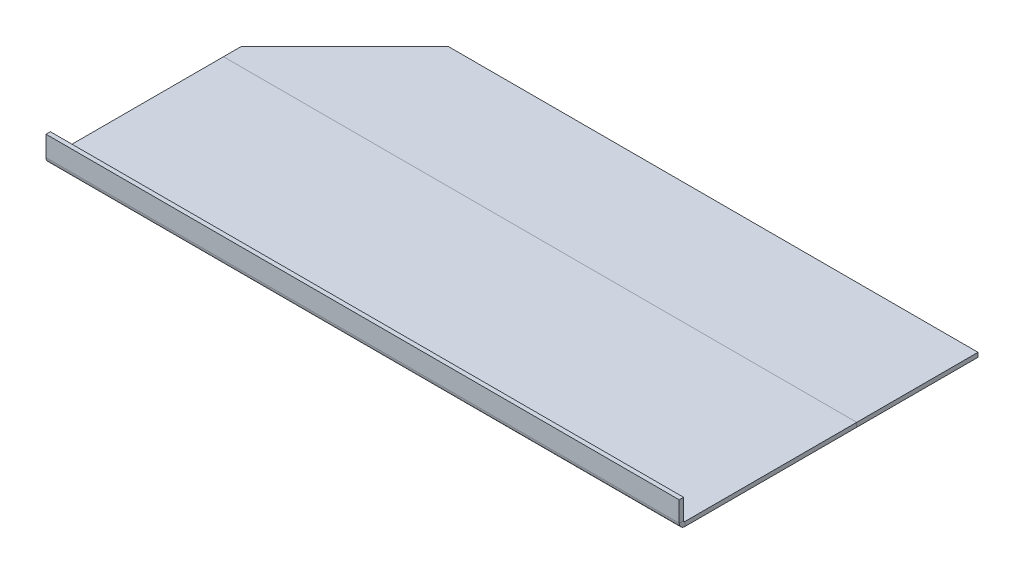
ISO-10303-21;
HEADER;
FILE_DESCRIPTION(('STEP AP214'),'2;1');
FILE_NAME('part.step','',(''),(''),'','','');
FILE_SCHEMA(('AUTOMOTIVE_DESIGN { 1 0 10303 214 1 1 1 1 }'));
ENDSEC;
DATA;
#1=APPLICATION_CONTEXT('core data for automotive mechanical design processes');
#2=APPLICATION_PROTOCOL_DEFINITION('international standard','automotive_design',2000,#1);
#3=PRODUCT_CONTEXT('',#1,'mechanical');
#4=PRODUCT('Part','Part','',(#3));
#5=PRODUCT_RELATED_PRODUCT_CATEGORY('part','',(#4));
#6=PRODUCT_DEFINITION_FORMATION('','',#4);
#7=PRODUCT_DEFINITION_CONTEXT('part definition',#1,'design');
#8=PRODUCT_DEFINITION('design','',#6,#7);
#9=PRODUCT_DEFINITION_SHAPE('','',#8);
#10=(LENGTH_UNIT() NAMED_UNIT(*) SI_UNIT(.MILLI.,.METRE.));
#11=(NAMED_UNIT(*) PLANE_ANGLE_UNIT() SI_UNIT($,.RADIAN.));
#12=(NAMED_UNIT(*) SI_UNIT($,.STERADIAN.) SOLID_ANGLE_UNIT());
#13=UNCERTAINTY_MEASURE_WITH_UNIT(LENGTH_MEASURE(1.E-05),#10,'distance_accuracy_value','');
#14=(GEOMETRIC_REPRESENTATION_CONTEXT(3) GLOBAL_UNCERTAINTY_ASSIGNED_CONTEXT((#13)) GLOBAL_UNIT_ASSIGNED_CONTEXT((#10,
#11,#12)) REPRESENTATION_CONTEXT('',''));
#15=CARTESIAN_POINT('',(0.,0.,0.));
#16=DIRECTION('',(0.,0.,1.));
#17=DIRECTION('',(1.,0.,0.));
#18=AXIS2_PLACEMENT_3D('',#15,#16,#17);
#19=CARTESIAN_POINT('',(232.0925,-3.175,-63.78575));
#20=DIRECTION('',(1.,0.,0.));
#21=DIRECTION('',(0.,0.,-1.));
#22=AXIS2_PLACEMENT_3D('',#19,#20,#21);
#23=PLANE('',#22);
#24=DIRECTION('',(0.,0.,-1.));
#25=VECTOR('',#24,1.);
#26=CARTESIAN_POINT('',(232.0925,0.,-63.78575));
#27=LINE('',#26,#25);
#28=CARTESIAN_POINT('',(232.0925,0.,62.15075));
#29=VERTEX_POINT('',#28);
#30=CARTESIAN_POINT('',(232.0925,0.,-63.78575));
#31=VERTEX_POINT('',#30);
#32=EDGE_CURVE('E118',#29,#31,#27,.T.);
#33=ORIENTED_EDGE('',*,*,#32,.F.);
#34=DIRECTION('',(0.,-1.,0.));
#35=VECTOR('',#34,1.);
#36=CARTESIAN_POINT('',(232.0925,0.,62.15075));
#37=LINE('',#36,#35);
#38=CARTESIAN_POINT('',(232.0925,-3.175,62.15075));
#39=VERTEX_POINT('',#38);
#40=EDGE_CURVE('E127',#29,#39,#37,.T.);
#41=ORIENTED_EDGE('',*,*,#40,.T.);
#42=DIRECTION('',(0.,0.,-1.));
#43=VECTOR('',#42,1.);
#44=CARTESIAN_POINT('',(232.0925,-3.175,-63.78575));
#45=LINE('',#44,#43);
#46=CARTESIAN_POINT('',(232.0925,-3.175,-63.78575));
#47=VERTEX_POINT('',#46);
#48=EDGE_CURVE('E115',#39,#47,#45,.T.);
#49=ORIENTED_EDGE('',*,*,#48,.T.);
#50=DIRECTION('',(0.,1.,0.));
#51=VECTOR('',#50,1.);
#52=CARTESIAN_POINT('',(232.0925,-3.175,-63.78575));
#53=LINE('',#52,#51);
#54=EDGE_CURVE('E73',#47,#31,#53,.T.);
#55=ORIENTED_EDGE('',*,*,#54,.T.);
#56=EDGE_LOOP('',(#33,#41,#49,#55));
#57=FACE_BOUND('',#56,.T.);
#58=ADVANCED_FACE('F70',(#57),#23,.T.);
#59=CARTESIAN_POINT('',(0.,-3.175,0.));
#60=DIRECTION('',(0.,1.,0.));
#61=DIRECTION('',(0.,0.,1.));
#62=AXIS2_PLACEMENT_3D('',#59,#60,#61);
#63=PLANE('',#62);
#64=DIRECTION('',(1.,0.,0.));
#65=VECTOR('',#64,1.);
#66=CARTESIAN_POINT('',(232.0925,-3.175,62.15075));
#67=LINE('',#66,#65);
#68=CARTESIAN_POINT('',(-232.0925,-3.175,62.15075));
#69=VERTEX_POINT('',#68);
#70=EDGE_CURVE('E143',#39,#69,#67,.F.);
#71=ORIENTED_EDGE('',*,*,#70,.T.);
#72=DIRECTION('',(0.,0.,1.));
#73=VECTOR('',#72,1.);
#74=CARTESIAN_POINT('',(-232.0925,-3.175,-63.78575));
#75=LINE('',#74,#73);
#76=CARTESIAN_POINT('',(-232.0925,-3.175,-63.78575));
#77=VERTEX_POINT('',#76);
#78=EDGE_CURVE('E123',#77,#69,#75,.T.);
#79=ORIENTED_EDGE('',*,*,#78,.F.);
#80=DIRECTION('',(-1.,0.,0.));
#81=VECTOR('',#80,1.);
#82=CARTESIAN_POINT('',(-232.0925,-3.175,-63.78575));
#83=LINE('',#82,#81);
#84=EDGE_CURVE('E108',#47,#77,#83,.T.);
#85=ORIENTED_EDGE('',*,*,#84,.F.);
#86=ORIENTED_EDGE('',*,*,#48,.F.);
#87=EDGE_LOOP('',(#71,#79,#85,#86));
#88=FACE_BOUND('',#87,.T.);
#89=ADVANCED_FACE('F221',(#88),#63,.F.);
#90=CARTESIAN_POINT('',(0.,0.,0.));
#91=DIRECTION('',(0.,1.,0.));
#92=DIRECTION('',(0.,0.,1.));
#93=AXIS2_PLACEMENT_3D('',#90,#91,#92);
#94=PLANE('',#93);
#95=DIRECTION('',(0.,0.,1.));
#96=VECTOR('',#95,1.);
#97=CARTESIAN_POINT('',(-232.0925,0.,-63.78575));
#98=LINE('',#97,#96);
#99=CARTESIAN_POINT('',(-232.0925,0.,-63.78575));
#100=VERTEX_POINT('',#99);
#101=CARTESIAN_POINT('',(-232.0925,0.,62.15075));
#102=VERTEX_POINT('',#101);
#103=EDGE_CURVE('E110',#100,#102,#98,.T.);
#104=ORIENTED_EDGE('',*,*,#103,.T.);
#105=DIRECTION('',(1.,0.,0.));
#106=VECTOR('',#105,1.);
#107=CARTESIAN_POINT('',(232.0925,0.,62.15075));
#108=LINE('',#107,#106);
#109=EDGE_CURVE('E84',#29,#102,#108,.F.);
#110=ORIENTED_EDGE('',*,*,#109,.F.);
#111=ORIENTED_EDGE('',*,*,#32,.T.);
#112=DIRECTION('',(-1.,0.,0.));
#113=VECTOR('',#112,1.);
#114=CARTESIAN_POINT('',(-232.0925,0.,-63.78575));
#115=LINE('',#114,#113);
#116=EDGE_CURVE('E106',#31,#100,#115,.T.);
#117=ORIENTED_EDGE('',*,*,#116,.T.);
#118=EDGE_LOOP('',(#104,#110,#111,#117));
#119=FACE_BOUND('',#118,.T.);
#120=ADVANCED_FACE('F117',(#119),#94,.T.);
#121=CARTESIAN_POINT('',(-232.0925,-3.175,-63.78575));
#122=DIRECTION('',(-1.,0.,0.));
#123=DIRECTION('',(0.,0.,1.));
#124=AXIS2_PLACEMENT_3D('',#121,#122,#123);
#125=PLANE('',#124);
#126=DIRECTION('',(0.,-1.,0.));
#127=VECTOR('',#126,1.);
#128=CARTESIAN_POINT('',(-232.0925,0.,62.15075));
#129=LINE('',#128,#127);
#130=EDGE_CURVE('E114',#102,#69,#129,.T.);
#131=ORIENTED_EDGE('',*,*,#130,.F.);
#132=ORIENTED_EDGE('',*,*,#103,.F.);
#133=DIRECTION('',(0.,1.,0.));
#134=VECTOR('',#133,1.);
#135=CARTESIAN_POINT('',(-232.0925,-3.175,-63.78575));
#136=LINE('',#135,#134);
#137=EDGE_CURVE('E14',#77,#100,#136,.T.);
#138=ORIENTED_EDGE('',*,*,#137,.F.);
#139=ORIENTED_EDGE('',*,*,#78,.T.);
#140=EDGE_LOOP('',(#131,#132,#138,#139));
#141=FACE_BOUND('',#140,.T.);
#142=ADVANCED_FACE('F111',(#141),#125,.T.);
#143=CARTESIAN_POINT('',(-232.0925,-3.175,-63.78575));
#144=DIRECTION('',(0.,0.,-1.));
#145=DIRECTION('',(-1.,0.,0.));
#146=AXIS2_PLACEMENT_3D('',#143,#144,#145);
#147=PLANE('',#146);
#148=ORIENTED_EDGE('',*,*,#116,.F.);
#149=ORIENTED_EDGE('',*,*,#54,.F.);
#150=ORIENTED_EDGE('',*,*,#84,.T.);
#151=ORIENTED_EDGE('',*,*,#137,.T.);
#152=EDGE_LOOP('',(#148,#149,#150,#151));
#153=FACE_BOUND('',#152,.T.);
#154=ADVANCED_FACE('F103',(#153),#147,.T.);
#155=CARTESIAN_POINT('',(-232.0925,1.,62.15075));
#156=DIRECTION('',(-1.,0.,0.));
#157=DIRECTION('',(0.,0.,1.));
#158=AXIS2_PLACEMENT_3D('',#155,#156,#157);
#159=PLANE('',#158);
#160=DIRECTION('',(0.,0.,-1.));
#161=VECTOR('',#160,1.);
#162=CARTESIAN_POINT('',(-232.0925,1.,66.32575));
#163=LINE('',#162,#161);
#164=CARTESIAN_POINT('',(-232.0925,1.,63.15075));
#165=VERTEX_POINT('',#164);
#166=CARTESIAN_POINT('',(-232.0925,1.,66.32575));
#167=VERTEX_POINT('',#166);
#168=EDGE_CURVE('E148',#165,#167,#163,.F.);
#169=ORIENTED_EDGE('',*,*,#168,.F.);
#170=CARTESIAN_POINT('',(-232.0925,1.,62.15075));
#171=DIRECTION('',(1.,0.,0.));
#172=DIRECTION('',(0.,0.,-1.));
#173=AXIS2_PLACEMENT_3D('',#170,#171,#172);
#174=CIRCLE('',#173,1.);
#175=EDGE_CURVE('E137',#102,#165,#174,.F.);
#176=ORIENTED_EDGE('',*,*,#175,.F.);
#177=ORIENTED_EDGE('',*,*,#130,.T.);
#178=CARTESIAN_POINT('',(-232.0925,1.,62.15075));
#179=DIRECTION('',(1.,0.,0.));
#180=DIRECTION('',(0.,0.,-1.));
#181=AXIS2_PLACEMENT_3D('',#178,#179,#180);
#182=CIRCLE('',#181,4.175);
#183=EDGE_CURVE('E130',#69,#167,#182,.F.);
#184=ORIENTED_EDGE('',*,*,#183,.T.);
#185=EDGE_LOOP('',(#169,#176,#177,#184));
#186=FACE_BOUND('',#185,.T.);
#187=ADVANCED_FACE('F225',(#186),#159,.T.);
#188=CARTESIAN_POINT('',(232.0925,1.,62.15075));
#189=DIRECTION('',(-1.,0.,0.));
#190=DIRECTION('',(0.,0.,1.));
#191=AXIS2_PLACEMENT_3D('',#188,#189,#190);
#192=PLANE('',#191);
#193=CARTESIAN_POINT('',(232.0925,1.,62.15075));
#194=DIRECTION('',(1.,0.,0.));
#195=DIRECTION('',(0.,0.,-1.));
#196=AXIS2_PLACEMENT_3D('',#193,#194,#195);
#197=CIRCLE('',#196,1.);
#198=CARTESIAN_POINT('',(232.0925,1.,63.15075));
#199=VERTEX_POINT('',#198);
#200=EDGE_CURVE('E132',#199,#29,#197,.T.);
#201=ORIENTED_EDGE('',*,*,#200,.F.);
#202=DIRECTION('',(0.,0.,-1.));
#203=VECTOR('',#202,1.);
#204=CARTESIAN_POINT('',(232.0925,1.,63.15075));
#205=LINE('',#204,#203);
#206=CARTESIAN_POINT('',(232.0925,1.,66.32575));
#207=VERTEX_POINT('',#206);
#208=EDGE_CURVE('E154',#199,#207,#205,.F.);
#209=ORIENTED_EDGE('',*,*,#208,.T.);
#210=CARTESIAN_POINT('',(232.0925,1.,62.15075));
#211=DIRECTION('',(1.,0.,0.));
#212=DIRECTION('',(0.,0.,-1.));
#213=AXIS2_PLACEMENT_3D('',#210,#211,#212);
#214=CIRCLE('',#213,4.175);
#215=EDGE_CURVE('E140',#207,#39,#214,.T.);
#216=ORIENTED_EDGE('',*,*,#215,.T.);
#217=ORIENTED_EDGE('',*,*,#40,.F.);
#218=EDGE_LOOP('',(#201,#209,#216,#217));
#219=FACE_BOUND('',#218,.T.);
#220=ADVANCED_FACE('F235',(#219),#192,.F.);
#221=CARTESIAN_POINT('',(232.0925,1.,62.15075));
#222=DIRECTION('',(1.,0.,0.));
#223=DIRECTION('',(0.,0.,1.));
#224=AXIS2_PLACEMENT_3D('',#221,#222,#223);
#225=CYLINDRICAL_SURFACE('',#224,4.175);
#226=ORIENTED_EDGE('',*,*,#70,.F.);
#227=ORIENTED_EDGE('',*,*,#215,.F.);
#228=DIRECTION('',(1.,0.,0.));
#229=VECTOR('',#228,1.);
#230=CARTESIAN_POINT('',(-232.0925,1.,66.32575));
#231=LINE('',#230,#229);
#232=EDGE_CURVE('E157',#207,#167,#231,.F.);
#233=ORIENTED_EDGE('',*,*,#232,.T.);
#234=ORIENTED_EDGE('',*,*,#183,.F.);
#235=EDGE_LOOP('',(#226,#227,#233,#234));
#236=FACE_BOUND('',#235,.T.);
#237=ADVANCED_FACE('F226',(#236),#225,.T.);
#238=CARTESIAN_POINT('',(232.0925,1.,62.15075));
#239=DIRECTION('',(1.,0.,0.));
#240=DIRECTION('',(0.,0.,1.));
#241=AXIS2_PLACEMENT_3D('',#238,#239,#240);
#242=CYLINDRICAL_SURFACE('',#241,1.);
#243=ORIENTED_EDGE('',*,*,#109,.T.);
#244=ORIENTED_EDGE('',*,*,#175,.T.);
#245=DIRECTION('',(1.,0.,0.));
#246=VECTOR('',#245,1.);
#247=CARTESIAN_POINT('',(-232.0925,1.,63.15075));
#248=LINE('',#247,#246);
#249=EDGE_CURVE('E151',#165,#199,#248,.T.);
#250=ORIENTED_EDGE('',*,*,#249,.T.);
#251=ORIENTED_EDGE('',*,*,#200,.T.);
#252=EDGE_LOOP('',(#243,#244,#250,#251));
#253=FACE_BOUND('',#252,.T.);
#254=ADVANCED_FACE('F238',(#253),#242,.F.);
#255=CARTESIAN_POINT('',(232.0925,15.875,66.32575));
#256=DIRECTION('',(-1.,0.,0.));
#257=DIRECTION('',(0.,0.,1.));
#258=AXIS2_PLACEMENT_3D('',#255,#256,#257);
#259=PLANE('',#258);
#260=ORIENTED_EDGE('',*,*,#208,.F.);
#261=DIRECTION('',(0.,-1.,0.));
#262=VECTOR('',#261,1.);
#263=CARTESIAN_POINT('',(232.0925,15.875,63.15075));
#264=LINE('',#263,#262);
#265=CARTESIAN_POINT('',(232.0925,15.875,63.15075));
#266=VERTEX_POINT('',#265);
#267=EDGE_CURVE('E160',#199,#266,#264,.F.);
#268=ORIENTED_EDGE('',*,*,#267,.T.);
#269=DIRECTION('',(0.,0.,-1.));
#270=VECTOR('',#269,1.);
#271=CARTESIAN_POINT('',(232.0925,15.875,66.32575));
#272=LINE('',#271,#270);
#273=CARTESIAN_POINT('',(232.0925,15.875,66.32575));
#274=VERTEX_POINT('',#273);
#275=EDGE_CURVE('E135',#274,#266,#272,.T.);
#276=ORIENTED_EDGE('',*,*,#275,.F.);
#277=DIRECTION('',(0.,1.,0.));
#278=VECTOR('',#277,1.);
#279=CARTESIAN_POINT('',(232.0925,0.,66.32575));
#280=LINE('',#279,#278);
#281=EDGE_CURVE('E169',#207,#274,#280,.T.);
#282=ORIENTED_EDGE('',*,*,#281,.F.);
#283=EDGE_LOOP('',(#260,#268,#276,#282));
#284=FACE_BOUND('',#283,.T.);
#285=ADVANCED_FACE('F232',(#284),#259,.F.);
#286=CARTESIAN_POINT('',(-232.0925,0.,66.32575));
#287=DIRECTION('',(1.,0.,0.));
#288=DIRECTION('',(0.,0.,-1.));
#289=AXIS2_PLACEMENT_3D('',#286,#287,#288);
#290=PLANE('',#289);
#291=ORIENTED_EDGE('',*,*,#168,.T.);
#292=DIRECTION('',(0.,-1.,0.));
#293=VECTOR('',#292,1.);
#294=CARTESIAN_POINT('',(-232.0925,0.,66.32575));
#295=LINE('',#294,#293);
#296=CARTESIAN_POINT('',(-232.0925,15.875,66.32575));
#297=VERTEX_POINT('',#296);
#298=EDGE_CURVE('E175',#297,#167,#295,.T.);
#299=ORIENTED_EDGE('',*,*,#298,.F.);
#300=DIRECTION('',(0.,0.,-1.));
#301=VECTOR('',#300,1.);
#302=CARTESIAN_POINT('',(-232.0925,15.875,66.32575));
#303=LINE('',#302,#301);
#304=CARTESIAN_POINT('',(-232.0925,15.875,63.15075));
#305=VERTEX_POINT('',#304);
#306=EDGE_CURVE('E178',#297,#305,#303,.T.);
#307=ORIENTED_EDGE('',*,*,#306,.T.);
#308=DIRECTION('',(0.,1.,0.));
#309=VECTOR('',#308,1.);
#310=CARTESIAN_POINT('',(-232.0925,0.,63.15075));
#311=LINE('',#310,#309);
#312=EDGE_CURVE('E166',#305,#165,#311,.F.);
#313=ORIENTED_EDGE('',*,*,#312,.T.);
#314=EDGE_LOOP('',(#291,#299,#307,#313));
#315=FACE_BOUND('',#314,.T.);
#316=ADVANCED_FACE('F204',(#315),#290,.F.);
#317=CARTESIAN_POINT('',(0.,0.,66.32575));
#318=DIRECTION('',(0.,0.,-1.));
#319=DIRECTION('',(-1.,0.,0.));
#320=AXIS2_PLACEMENT_3D('',#317,#318,#319);
#321=PLANE('',#320);
#322=ORIENTED_EDGE('',*,*,#232,.F.);
#323=ORIENTED_EDGE('',*,*,#281,.T.);
#324=DIRECTION('',(-1.,0.,0.));
#325=VECTOR('',#324,1.);
#326=CARTESIAN_POINT('',(0.,15.875,66.32575));
#327=LINE('',#326,#325);
#328=EDGE_CURVE('E172',#274,#297,#327,.T.);
#329=ORIENTED_EDGE('',*,*,#328,.T.);
#330=ORIENTED_EDGE('',*,*,#298,.T.);
#331=EDGE_LOOP('',(#322,#323,#329,#330));
#332=FACE_BOUND('',#331,.T.);
#333=ADVANCED_FACE('F229',(#332),#321,.F.);
#334=CARTESIAN_POINT('',(0.,0.,63.15075));
#335=DIRECTION('',(0.,0.,-1.));
#336=DIRECTION('',(-1.,0.,0.));
#337=AXIS2_PLACEMENT_3D('',#334,#335,#336);
#338=PLANE('',#337);
#339=ORIENTED_EDGE('',*,*,#267,.F.);
#340=ORIENTED_EDGE('',*,*,#249,.F.);
#341=ORIENTED_EDGE('',*,*,#312,.F.);
#342=DIRECTION('',(1.,0.,0.));
#343=VECTOR('',#342,1.);
#344=CARTESIAN_POINT('',(-232.0925,15.875,63.15075));
#345=LINE('',#344,#343);
#346=EDGE_CURVE('E163',#266,#305,#345,.F.);
#347=ORIENTED_EDGE('',*,*,#346,.F.);
#348=EDGE_LOOP('',(#339,#340,#341,#347));
#349=FACE_BOUND('',#348,.T.);
#350=ADVANCED_FACE('F198',(#349),#338,.T.);
#351=CARTESIAN_POINT('',(-232.0925,15.875,66.32575));
#352=DIRECTION('',(0.,-1.,0.));
#353=DIRECTION('',(0.,0.,-1.));
#354=AXIS2_PLACEMENT_3D('',#351,#352,#353);
#355=PLANE('',#354);
#356=ORIENTED_EDGE('',*,*,#346,.T.);
#357=ORIENTED_EDGE('',*,*,#306,.F.);
#358=ORIENTED_EDGE('',*,*,#328,.F.);
#359=ORIENTED_EDGE('',*,*,#275,.T.);
#360=EDGE_LOOP('',(#356,#357,#358,#359));
#361=FACE_BOUND('',#360,.T.);
#362=ADVANCED_FACE('F187',(#361),#355,.F.);
#363=CLOSED_SHELL('',(#58,#89,#120,#142,#154,#187,#220,#237,#254,#285,#316,#333,#350,#362));
#364=MANIFOLD_SOLID_BREP('B2',#363);
#365=CARTESIAN_POINT('',(-232.0925,-3.175,-76.48575));
#366=DIRECTION('',(-1.,0.,0.));
#367=DIRECTION('',(0.,0.,1.));
#368=AXIS2_PLACEMENT_3D('',#365,#366,#367);
#369=PLANE('',#368);
#370=DIRECTION('',(0.,0.,1.));
#371=VECTOR('',#370,1.);
#372=CARTESIAN_POINT('',(-232.0925,0.,-76.48575));
#373=LINE('',#372,#371);
#374=CARTESIAN_POINT('',(-232.0925,0.,-76.48575));
#375=VERTEX_POINT('',#374);
#376=CARTESIAN_POINT('',(-232.0925,0.,-63.78575));
#377=VERTEX_POINT('',#376);
#378=EDGE_CURVE('E458',#375,#377,#373,.T.);
#379=ORIENTED_EDGE('',*,*,#378,.F.);
#380=DIRECTION('',(0.,1.,0.));
#381=VECTOR('',#380,1.);
#382=CARTESIAN_POINT('',(-232.0925,-3.175,-76.48575));
#383=LINE('',#382,#381);
#384=CARTESIAN_POINT('',(-232.0925,-3.175,-76.48575));
#385=VERTEX_POINT('',#384);
#386=EDGE_CURVE('E68',#385,#375,#383,.T.);
#387=ORIENTED_EDGE('',*,*,#386,.F.);
#388=DIRECTION('',(0.,0.,1.));
#389=VECTOR('',#388,1.);
#390=CARTESIAN_POINT('',(-232.0925,-3.175,-76.48575));
#391=LINE('',#390,#389);
#392=CARTESIAN_POINT('',(-232.0925,-3.175,-63.78575));
#393=VERTEX_POINT('',#392);
#394=EDGE_CURVE('E453',#385,#393,#391,.T.);
#395=ORIENTED_EDGE('',*,*,#394,.T.);
#396=DIRECTION('',(0.,1.,0.));
#397=VECTOR('',#396,1.);
#398=CARTESIAN_POINT('',(-232.0925,-3.175,-63.78575));
#399=LINE('',#398,#397);
#400=EDGE_CURVE('E384',#393,#377,#399,.T.);
#401=ORIENTED_EDGE('',*,*,#400,.T.);
#402=EDGE_LOOP('',(#379,#387,#395,#401));
#403=FACE_BOUND('',#402,.T.);
#404=ADVANCED_FACE('F381',(#403),#369,.T.);
#405=CARTESIAN_POINT('',(-155.8925,-3.175,-152.68575));
#406=DIRECTION('',(-0.707106781186548,0.,-0.707106781186546));
#407=DIRECTION('',(-0.707106781186547,0.,0.707106781186549));
#408=AXIS2_PLACEMENT_3D('',#405,#406,#407);
#409=PLANE('',#408);
#410=DIRECTION('',(-0.707106781186546,0.,0.707106781186548));
#411=VECTOR('',#410,1.);
#412=CARTESIAN_POINT('',(-155.8925,0.,-152.68575));
#413=LINE('',#412,#411);
#414=CARTESIAN_POINT('',(-155.8925,0.,-152.68575));
#415=VERTEX_POINT('',#414);
#416=EDGE_CURVE('E467',#415,#375,#413,.T.);
#417=ORIENTED_EDGE('',*,*,#416,.F.);
#418=DIRECTION('',(0.,1.,0.));
#419=VECTOR('',#418,1.);
#420=CARTESIAN_POINT('',(-155.8925,-3.175,-152.68575));
#421=LINE('',#420,#419);
#422=CARTESIAN_POINT('',(-155.8925,-3.175,-152.68575));
#423=VERTEX_POINT('',#422);
#424=EDGE_CURVE('E390',#423,#415,#421,.T.);
#425=ORIENTED_EDGE('',*,*,#424,.F.);
#426=DIRECTION('',(-0.707106781186546,0.,0.707106781186548));
#427=VECTOR('',#426,1.);
#428=CARTESIAN_POINT('',(-155.8925,-3.175,-152.68575));
#429=LINE('',#428,#427);
#430=EDGE_CURVE('E448',#423,#385,#429,.T.);
#431=ORIENTED_EDGE('',*,*,#430,.T.);
#432=ORIENTED_EDGE('',*,*,#386,.T.);
#433=EDGE_LOOP('',(#417,#425,#431,#432));
#434=FACE_BOUND('',#433,.T.);
#435=ADVANCED_FACE('F473',(#434),#409,.T.);
#436=CARTESIAN_POINT('',(232.0925,-3.175,-152.68575));
#437=DIRECTION('',(0.,0.,-1.));
#438=DIRECTION('',(-1.,0.,0.));
#439=AXIS2_PLACEMENT_3D('',#436,#437,#438);
#440=PLANE('',#439);
#441=DIRECTION('',(-1.,0.,0.));
#442=VECTOR('',#441,1.);
#443=CARTESIAN_POINT('',(232.0925,0.,-152.68575));
#444=LINE('',#443,#442);
#445=CARTESIAN_POINT('',(232.0925,0.,-152.68575));
#446=VERTEX_POINT('',#445);
#447=EDGE_CURVE('E437',#446,#415,#444,.T.);
#448=ORIENTED_EDGE('',*,*,#447,.F.);
#449=DIRECTION('',(0.,1.,0.));
#450=VECTOR('',#449,1.);
#451=CARTESIAN_POINT('',(232.0925,-3.175,-152.68575));
#452=LINE('',#451,#450);
#453=CARTESIAN_POINT('',(232.0925,-3.175,-152.68575));
#454=VERTEX_POINT('',#453);
#455=EDGE_CURVE('E432',#454,#446,#452,.T.);
#456=ORIENTED_EDGE('',*,*,#455,.F.);
#457=DIRECTION('',(-1.,0.,0.));
#458=VECTOR('',#457,1.);
#459=CARTESIAN_POINT('',(232.0925,-3.175,-152.68575));
#460=LINE('',#459,#458);
#461=EDGE_CURVE('E435',#454,#423,#460,.T.);
#462=ORIENTED_EDGE('',*,*,#461,.T.);
#463=ORIENTED_EDGE('',*,*,#424,.T.);
#464=EDGE_LOOP('',(#448,#456,#462,#463));
#465=FACE_BOUND('',#464,.T.);
#466=ADVANCED_FACE('F434',(#465),#440,.T.);
#467=CARTESIAN_POINT('',(232.0925,-3.175,-63.78575));
#468=DIRECTION('',(1.,0.,0.));
#469=DIRECTION('',(0.,0.,-1.));
#470=AXIS2_PLACEMENT_3D('',#467,#468,#469);
#471=PLANE('',#470);
#472=DIRECTION('',(0.,0.,-1.));
#473=VECTOR('',#472,1.);
#474=CARTESIAN_POINT('',(232.0925,0.,-63.78575));
#475=LINE('',#474,#473);
#476=CARTESIAN_POINT('',(232.0925,0.,-63.78575));
#477=VERTEX_POINT('',#476);
#478=EDGE_CURVE('E464',#477,#446,#475,.T.);
#479=ORIENTED_EDGE('',*,*,#478,.F.);
#480=DIRECTION('',(0.,1.,0.));
#481=VECTOR('',#480,1.);
#482=CARTESIAN_POINT('',(232.0925,-3.175,-63.78575));
#483=LINE('',#482,#481);
#484=CARTESIAN_POINT('',(232.0925,-3.175,-63.78575));
#485=VERTEX_POINT('',#484);
#486=EDGE_CURVE('E442',#485,#477,#483,.T.);
#487=ORIENTED_EDGE('',*,*,#486,.F.);
#488=DIRECTION('',(0.,0.,-1.));
#489=VECTOR('',#488,1.);
#490=CARTESIAN_POINT('',(232.0925,-3.175,-63.78575));
#491=LINE('',#490,#489);
#492=EDGE_CURVE('E447',#485,#454,#491,.T.);
#493=ORIENTED_EDGE('',*,*,#492,.T.);
#494=ORIENTED_EDGE('',*,*,#455,.T.);
#495=EDGE_LOOP('',(#479,#487,#493,#494));
#496=FACE_BOUND('',#495,.T.);
#497=ADVANCED_FACE('F450',(#496),#471,.T.);
#498=CARTESIAN_POINT('',(-232.0925,-3.175,-63.78575));
#499=DIRECTION('',(0.,0.,1.));
#500=DIRECTION('',(1.,0.,0.));
#501=AXIS2_PLACEMENT_3D('',#498,#499,#500);
#502=PLANE('',#501);
#503=DIRECTION('',(1.,0.,0.));
#504=VECTOR('',#503,1.);
#505=CARTESIAN_POINT('',(-232.0925,0.,-63.78575));
#506=LINE('',#505,#504);
#507=EDGE_CURVE('E461',#377,#477,#506,.T.);
#508=ORIENTED_EDGE('',*,*,#507,.F.);
#509=ORIENTED_EDGE('',*,*,#400,.F.);
#510=DIRECTION('',(1.,0.,0.));
#511=VECTOR('',#510,1.);
#512=CARTESIAN_POINT('',(-232.0925,-3.175,-63.78575));
#513=LINE('',#512,#511);
#514=EDGE_CURVE('E451',#393,#485,#513,.T.);
#515=ORIENTED_EDGE('',*,*,#514,.T.);
#516=ORIENTED_EDGE('',*,*,#486,.T.);
#517=EDGE_LOOP('',(#508,#509,#515,#516));
#518=FACE_BOUND('',#517,.T.);
#519=ADVANCED_FACE('F470',(#518),#502,.T.);
#520=CARTESIAN_POINT('',(0.,-3.175,0.));
#521=DIRECTION('',(0.,1.,0.));
#522=DIRECTION('',(0.,0.,1.));
#523=AXIS2_PLACEMENT_3D('',#520,#521,#522);
#524=PLANE('',#523);
#525=ORIENTED_EDGE('',*,*,#394,.F.);
#526=ORIENTED_EDGE('',*,*,#430,.F.);
#527=ORIENTED_EDGE('',*,*,#461,.F.);
#528=ORIENTED_EDGE('',*,*,#492,.F.);
#529=ORIENTED_EDGE('',*,*,#514,.F.);
#530=EDGE_LOOP('',(#525,#526,#527,#528,#529));
#531=FACE_BOUND('',#530,.T.);
#532=ADVANCED_FACE('F446',(#531),#524,.F.);
#533=CARTESIAN_POINT('',(0.,0.,0.));
#534=DIRECTION('',(0.,1.,0.));
#535=DIRECTION('',(0.,0.,1.));
#536=AXIS2_PLACEMENT_3D('',#533,#534,#535);
#537=PLANE('',#536);
#538=ORIENTED_EDGE('',*,*,#378,.T.);
#539=ORIENTED_EDGE('',*,*,#507,.T.);
#540=ORIENTED_EDGE('',*,*,#478,.T.);
#541=ORIENTED_EDGE('',*,*,#447,.T.);
#542=ORIENTED_EDGE('',*,*,#416,.T.);
#543=EDGE_LOOP('',(#538,#539,#540,#541,#542));
#544=FACE_BOUND('',#543,.T.);
#545=ADVANCED_FACE('F472',(#544),#537,.T.);
#546=CLOSED_SHELL('',(#404,#435,#466,#497,#519,#532,#545));
#547=MANIFOLD_SOLID_BREP('B8',#546);
#548=ADVANCED_BREP_SHAPE_REPRESENTATION('',(#18,#364,#547),#14);
#549=SHAPE_DEFINITION_REPRESENTATION(#9,#548);
ENDSEC;
END-ISO-10303-21;
